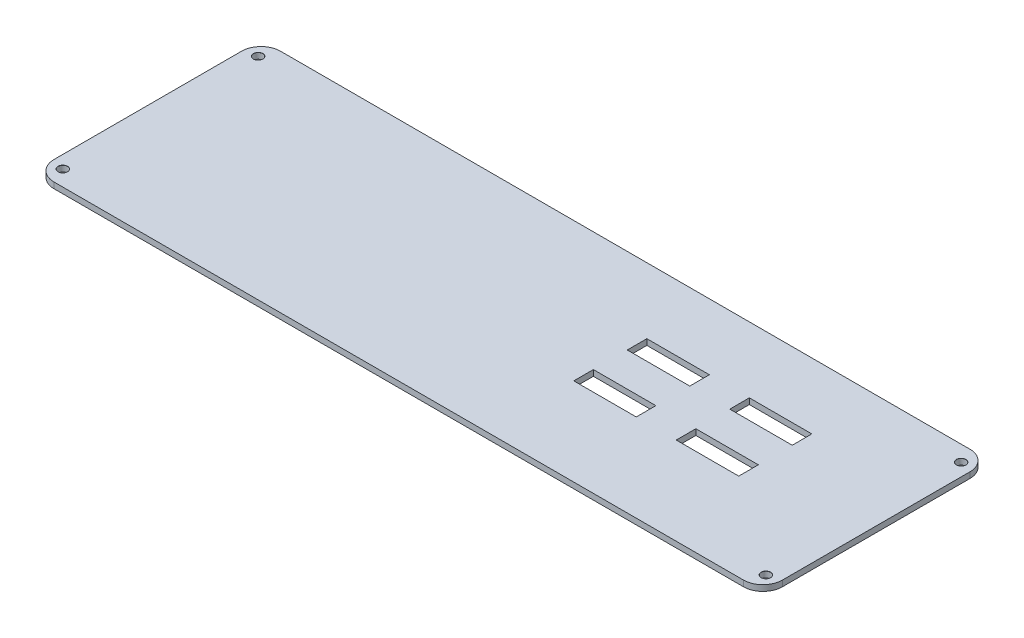
ISO-10303-21;
HEADER;
FILE_DESCRIPTION(('STEP AP214'),'2;1');
FILE_NAME('part.step','',(''),(''),'','','');
FILE_SCHEMA(('AUTOMOTIVE_DESIGN { 1 0 10303 214 1 1 1 1 }'));
ENDSEC;
DATA;
#1=APPLICATION_CONTEXT('core data for automotive mechanical design processes');
#2=APPLICATION_PROTOCOL_DEFINITION('international standard','automotive_design',2000,#1);
#3=PRODUCT_CONTEXT('',#1,'mechanical');
#4=PRODUCT('Part','Part','',(#3));
#5=PRODUCT_RELATED_PRODUCT_CATEGORY('part','',(#4));
#6=PRODUCT_DEFINITION_FORMATION('','',#4);
#7=PRODUCT_DEFINITION_CONTEXT('part definition',#1,'design');
#8=PRODUCT_DEFINITION('design','',#6,#7);
#9=PRODUCT_DEFINITION_SHAPE('','',#8);
#10=(LENGTH_UNIT() NAMED_UNIT(*) SI_UNIT(.MILLI.,.METRE.));
#11=(NAMED_UNIT(*) PLANE_ANGLE_UNIT() SI_UNIT($,.RADIAN.));
#12=(NAMED_UNIT(*) SI_UNIT($,.STERADIAN.) SOLID_ANGLE_UNIT());
#13=UNCERTAINTY_MEASURE_WITH_UNIT(LENGTH_MEASURE(1.E-05),#10,'distance_accuracy_value','');
#14=(GEOMETRIC_REPRESENTATION_CONTEXT(3) GLOBAL_UNCERTAINTY_ASSIGNED_CONTEXT((#13)) GLOBAL_UNIT_ASSIGNED_CONTEXT((#10,
#11,#12)) REPRESENTATION_CONTEXT('',''));
#15=CARTESIAN_POINT('',(0.,0.,0.));
#16=DIRECTION('',(0.,0.,1.));
#17=DIRECTION('',(1.,0.,0.));
#18=AXIS2_PLACEMENT_3D('',#15,#16,#17);
#19=CARTESIAN_POINT('',(-93.2500000000001,1.5,29.));
#20=DIRECTION('',(1.,0.,0.));
#21=DIRECTION('',(0.,0.,-1.));
#22=AXIS2_PLACEMENT_3D('',#19,#20,#21);
#23=PLANE('',#22);
#24=DIRECTION('',(0.,0.,1.));
#25=VECTOR('',#24,1.);
#26=CARTESIAN_POINT('',(-93.2500000000001,1.5,29.));
#27=LINE('',#26,#25);
#28=CARTESIAN_POINT('',(-93.2500000000001,1.5,-24.));
#29=VERTEX_POINT('',#28);
#30=CARTESIAN_POINT('',(-93.2500000000001,1.5,24.));
#31=VERTEX_POINT('',#30);
#32=EDGE_CURVE('E365',#29,#31,#27,.T.);
#33=ORIENTED_EDGE('',*,*,#32,.F.);
#34=DIRECTION('',(0.,-1.,0.));
#35=VECTOR('',#34,1.);
#36=CARTESIAN_POINT('',(-93.2500000000001,1.5,-24.));
#37=LINE('',#36,#35);
#38=CARTESIAN_POINT('',(-93.2500000000001,0.,-24.));
#39=VERTEX_POINT('',#38);
#40=EDGE_CURVE('E390',#29,#39,#37,.T.);
#41=ORIENTED_EDGE('',*,*,#40,.T.);
#42=DIRECTION('',(0.,0.,1.));
#43=VECTOR('',#42,1.);
#44=CARTESIAN_POINT('',(-93.2500000000001,0.,29.));
#45=LINE('',#44,#43);
#46=CARTESIAN_POINT('',(-93.2500000000001,0.,24.));
#47=VERTEX_POINT('',#46);
#48=EDGE_CURVE('E364',#39,#47,#45,.T.);
#49=ORIENTED_EDGE('',*,*,#48,.T.);
#50=DIRECTION('',(0.,-1.,0.));
#51=VECTOR('',#50,1.);
#52=CARTESIAN_POINT('',(-93.2500000000001,1.5,24.));
#53=LINE('',#52,#51);
#54=EDGE_CURVE('E378',#47,#31,#53,.F.);
#55=ORIENTED_EDGE('',*,*,#54,.T.);
#56=EDGE_LOOP('',(#33,#41,#49,#55));
#57=FACE_BOUND('',#56,.T.);
#58=ADVANCED_FACE('F37',(#57),#23,.F.);
#59=CARTESIAN_POINT('',(93.2499999999999,1.5,29.));
#60=DIRECTION('',(0.,0.,-1.));
#61=DIRECTION('',(-1.,0.,0.));
#62=AXIS2_PLACEMENT_3D('',#59,#60,#61);
#63=PLANE('',#62);
#64=DIRECTION('',(1.,0.,0.));
#65=VECTOR('',#64,1.);
#66=CARTESIAN_POINT('',(93.2499999999999,0.,29.));
#67=LINE('',#66,#65);
#68=CARTESIAN_POINT('',(-88.2500000000001,0.,29.));
#69=VERTEX_POINT('',#68);
#70=CARTESIAN_POINT('',(88.2499999999999,0.,29.));
#71=VERTEX_POINT('',#70);
#72=EDGE_CURVE('E381',#69,#71,#67,.T.);
#73=ORIENTED_EDGE('',*,*,#72,.T.);
#74=DIRECTION('',(0.,-1.,0.));
#75=VECTOR('',#74,1.);
#76=CARTESIAN_POINT('',(88.2499999999999,1.5,29.));
#77=LINE('',#76,#75);
#78=CARTESIAN_POINT('',(88.2499999999999,1.5,29.));
#79=VERTEX_POINT('',#78);
#80=EDGE_CURVE('E11',#71,#79,#77,.F.);
#81=ORIENTED_EDGE('',*,*,#80,.T.);
#82=DIRECTION('',(1.,0.,0.));
#83=VECTOR('',#82,1.);
#84=CARTESIAN_POINT('',(93.2499999999999,1.5,29.));
#85=LINE('',#84,#83);
#86=CARTESIAN_POINT('',(-88.2500000000001,1.5,29.));
#87=VERTEX_POINT('',#86);
#88=EDGE_CURVE('E368',#87,#79,#85,.T.);
#89=ORIENTED_EDGE('',*,*,#88,.F.);
#90=DIRECTION('',(0.,-1.,0.));
#91=VECTOR('',#90,1.);
#92=CARTESIAN_POINT('',(-88.2500000000001,1.5,29.));
#93=LINE('',#92,#91);
#94=EDGE_CURVE('E45',#87,#69,#93,.T.);
#95=ORIENTED_EDGE('',*,*,#94,.T.);
#96=EDGE_LOOP('',(#73,#81,#89,#95));
#97=FACE_BOUND('',#96,.T.);
#98=ADVANCED_FACE('F423',(#97),#63,.F.);
#99=CARTESIAN_POINT('',(93.2499999999999,1.5,29.));
#100=DIRECTION('',(-1.,0.,0.));
#101=DIRECTION('',(0.,0.,1.));
#102=AXIS2_PLACEMENT_3D('',#99,#100,#101);
#103=PLANE('',#102);
#104=DIRECTION('',(0.,0.,-1.));
#105=VECTOR('',#104,1.);
#106=CARTESIAN_POINT('',(93.2499999999999,0.,29.));
#107=LINE('',#106,#105);
#108=CARTESIAN_POINT('',(93.2499999999999,0.,24.));
#109=VERTEX_POINT('',#108);
#110=CARTESIAN_POINT('',(93.2499999999999,0.,-24.));
#111=VERTEX_POINT('',#110);
#112=EDGE_CURVE('E384',#109,#111,#107,.T.);
#113=ORIENTED_EDGE('',*,*,#112,.T.);
#114=DIRECTION('',(0.,-1.,0.));
#115=VECTOR('',#114,1.);
#116=CARTESIAN_POINT('',(93.2499999999999,1.5,-24.));
#117=LINE('',#116,#115);
#118=CARTESIAN_POINT('',(93.2499999999999,1.5,-24.));
#119=VERTEX_POINT('',#118);
#120=EDGE_CURVE('E417',#111,#119,#117,.F.);
#121=ORIENTED_EDGE('',*,*,#120,.T.);
#122=DIRECTION('',(0.,0.,-1.));
#123=VECTOR('',#122,1.);
#124=CARTESIAN_POINT('',(93.2499999999999,1.5,29.));
#125=LINE('',#124,#123);
#126=CARTESIAN_POINT('',(93.2499999999999,1.5,24.));
#127=VERTEX_POINT('',#126);
#128=EDGE_CURVE('E372',#127,#119,#125,.T.);
#129=ORIENTED_EDGE('',*,*,#128,.F.);
#130=DIRECTION('',(0.,-1.,0.));
#131=VECTOR('',#130,1.);
#132=CARTESIAN_POINT('',(93.2499999999999,1.5,24.));
#133=LINE('',#132,#131);
#134=EDGE_CURVE('E414',#127,#109,#133,.T.);
#135=ORIENTED_EDGE('',*,*,#134,.T.);
#136=EDGE_LOOP('',(#113,#121,#129,#135));
#137=FACE_BOUND('',#136,.T.);
#138=ADVANCED_FACE('F437',(#137),#103,.F.);
#139=CARTESIAN_POINT('',(93.2499999999999,1.5,-29.));
#140=DIRECTION('',(0.,0.,1.));
#141=DIRECTION('',(1.,0.,0.));
#142=AXIS2_PLACEMENT_3D('',#139,#140,#141);
#143=PLANE('',#142);
#144=DIRECTION('',(-1.,0.,0.));
#145=VECTOR('',#144,1.);
#146=CARTESIAN_POINT('',(93.2499999999999,0.,-29.));
#147=LINE('',#146,#145);
#148=CARTESIAN_POINT('',(88.2499999999999,0.,-29.));
#149=VERTEX_POINT('',#148);
#150=CARTESIAN_POINT('',(-88.2500000000001,0.,-29.));
#151=VERTEX_POINT('',#150);
#152=EDGE_CURVE('E369',#149,#151,#147,.T.);
#153=ORIENTED_EDGE('',*,*,#152,.T.);
#154=DIRECTION('',(0.,-1.,0.));
#155=VECTOR('',#154,1.);
#156=CARTESIAN_POINT('',(-88.2500000000001,1.5,-29.));
#157=LINE('',#156,#155);
#158=CARTESIAN_POINT('',(-88.2500000000001,1.5,-29.));
#159=VERTEX_POINT('',#158);
#160=EDGE_CURVE('E404',#151,#159,#157,.F.);
#161=ORIENTED_EDGE('',*,*,#160,.T.);
#162=DIRECTION('',(-1.,0.,0.));
#163=VECTOR('',#162,1.);
#164=CARTESIAN_POINT('',(93.2499999999999,1.5,-29.));
#165=LINE('',#164,#163);
#166=CARTESIAN_POINT('',(88.2499999999999,1.5,-29.));
#167=VERTEX_POINT('',#166);
#168=EDGE_CURVE('E375',#167,#159,#165,.T.);
#169=ORIENTED_EDGE('',*,*,#168,.F.);
#170=DIRECTION('',(0.,-1.,0.));
#171=VECTOR('',#170,1.);
#172=CARTESIAN_POINT('',(88.2499999999999,1.5,-29.));
#173=LINE('',#172,#171);
#174=EDGE_CURVE('E401',#167,#149,#173,.T.);
#175=ORIENTED_EDGE('',*,*,#174,.T.);
#176=EDGE_LOOP('',(#153,#161,#169,#175));
#177=FACE_BOUND('',#176,.T.);
#178=ADVANCED_FACE('F447',(#177),#143,.F.);
#179=CARTESIAN_POINT('',(0.,1.5,0.));
#180=DIRECTION('',(0.,1.,0.));
#181=DIRECTION('',(0.,0.,1.));
#182=AXIS2_PLACEMENT_3D('',#179,#180,#181);
#183=PLANE('',#182);
#184=DIRECTION('',(0.,0.,1.));
#185=VECTOR('',#184,1.);
#186=CARTESIAN_POINT('',(48.6113406976716,1.5,-12.1528351744179));
#187=LINE('',#186,#185);
#188=CARTESIAN_POINT('',(48.6113406976716,1.5,-12.1528351744179));
#189=VERTEX_POINT('',#188);
#190=CARTESIAN_POINT('',(48.6113406976716,1.5,-7.1373793881502));
#191=VERTEX_POINT('',#190);
#192=EDGE_CURVE('E52',#189,#191,#187,.T.);
#193=ORIENTED_EDGE('',*,*,#192,.F.);
#194=DIRECTION('',(-1.,0.,0.));
#195=VECTOR('',#194,1.);
#196=CARTESIAN_POINT('',(48.6113406976716,1.5,-12.1528351744179));
#197=LINE('',#196,#195);
#198=CARTESIAN_POINT('',(64.6113406976716,1.5,-12.1528351744179));
#199=VERTEX_POINT('',#198);
#200=EDGE_CURVE('E248',#199,#189,#197,.T.);
#201=ORIENTED_EDGE('',*,*,#200,.F.);
#202=DIRECTION('',(0.,0.,-1.));
#203=VECTOR('',#202,1.);
#204=CARTESIAN_POINT('',(64.6113406976716,1.5,-12.1528351744179));
#205=LINE('',#204,#203);
#206=CARTESIAN_POINT('',(64.6113406976716,1.5,-7.1373793881502));
#207=VERTEX_POINT('',#206);
#208=EDGE_CURVE('E251',#207,#199,#205,.T.);
#209=ORIENTED_EDGE('',*,*,#208,.F.);
#210=DIRECTION('',(1.,0.,0.));
#211=VECTOR('',#210,1.);
#212=CARTESIAN_POINT('',(48.6113406976716,1.5,-7.1373793881502));
#213=LINE('',#212,#211);
#214=EDGE_CURVE('E255',#191,#207,#213,.T.);
#215=ORIENTED_EDGE('',*,*,#214,.F.);
#216=EDGE_LOOP('',(#193,#201,#209,#215));
#217=FACE_BOUND('',#216,.T.);
#218=DIRECTION('',(0.,0.,1.));
#219=VECTOR('',#218,1.);
#220=CARTESIAN_POINT('',(22.3766488925789,1.5,1.54321716500545));
#221=LINE('',#220,#219);
#222=CARTESIAN_POINT('',(22.3766488925789,1.5,1.54321716500545));
#223=VERTEX_POINT('',#222);
#224=CARTESIAN_POINT('',(22.3766488925789,1.5,6.55867295127315));
#225=VERTEX_POINT('',#224);
#226=EDGE_CURVE('E60',#223,#225,#221,.T.);
#227=ORIENTED_EDGE('',*,*,#226,.F.);
#228=DIRECTION('',(-1.,0.,0.));
#229=VECTOR('',#228,1.);
#230=CARTESIAN_POINT('',(22.3766488925789,1.5,1.54321716500545));
#231=LINE('',#230,#229);
#232=CARTESIAN_POINT('',(38.3766488925789,1.5,1.54321716500545));
#233=VERTEX_POINT('',#232);
#234=EDGE_CURVE('E276',#233,#223,#231,.T.);
#235=ORIENTED_EDGE('',*,*,#234,.F.);
#236=DIRECTION('',(0.,0.,-1.));
#237=VECTOR('',#236,1.);
#238=CARTESIAN_POINT('',(38.3766488925789,1.5,1.54321716500545));
#239=LINE('',#238,#237);
#240=CARTESIAN_POINT('',(38.3766488925789,1.5,6.55867295127315));
#241=VERTEX_POINT('',#240);
#242=EDGE_CURVE('E279',#241,#233,#239,.T.);
#243=ORIENTED_EDGE('',*,*,#242,.F.);
#244=DIRECTION('',(1.,0.,0.));
#245=VECTOR('',#244,1.);
#246=CARTESIAN_POINT('',(22.3766488925789,1.5,6.55867295127315));
#247=LINE('',#246,#245);
#248=EDGE_CURVE('E283',#225,#241,#247,.T.);
#249=ORIENTED_EDGE('',*,*,#248,.F.);
#250=EDGE_LOOP('',(#227,#235,#243,#249));
#251=FACE_BOUND('',#250,.T.);
#252=DIRECTION('',(0.,0.,1.));
#253=VECTOR('',#252,1.);
#254=CARTESIAN_POINT('',(48.6113406976716,1.5,1.54321716500545));
#255=LINE('',#254,#253);
#256=CARTESIAN_POINT('',(48.6113406976716,1.5,1.54321716500545));
#257=VERTEX_POINT('',#256);
#258=CARTESIAN_POINT('',(48.6113406976716,1.5,6.55867295127315));
#259=VERTEX_POINT('',#258);
#260=EDGE_CURVE('E200',#257,#259,#255,.T.);
#261=ORIENTED_EDGE('',*,*,#260,.F.);
#262=DIRECTION('',(-1.,0.,0.));
#263=VECTOR('',#262,1.);
#264=CARTESIAN_POINT('',(48.6113406976716,1.5,1.54321716500545));
#265=LINE('',#264,#263);
#266=CARTESIAN_POINT('',(64.6113406976716,1.5,1.54321716500545));
#267=VERTEX_POINT('',#266);
#268=EDGE_CURVE('E210',#267,#257,#265,.T.);
#269=ORIENTED_EDGE('',*,*,#268,.F.);
#270=DIRECTION('',(0.,0.,-1.));
#271=VECTOR('',#270,1.);
#272=CARTESIAN_POINT('',(64.6113406976716,1.5,1.54321716500545));
#273=LINE('',#272,#271);
#274=CARTESIAN_POINT('',(64.6113406976716,1.5,6.55867295127315));
#275=VERTEX_POINT('',#274);
#276=EDGE_CURVE('E215',#275,#267,#273,.T.);
#277=ORIENTED_EDGE('',*,*,#276,.F.);
#278=DIRECTION('',(1.,0.,0.));
#279=VECTOR('',#278,1.);
#280=CARTESIAN_POINT('',(48.6113406976716,1.5,6.55867295127315));
#281=LINE('',#280,#279);
#282=EDGE_CURVE('E221',#259,#275,#281,.T.);
#283=ORIENTED_EDGE('',*,*,#282,.F.);
#284=EDGE_LOOP('',(#261,#269,#277,#283));
#285=FACE_BOUND('',#284,.T.);
#286=DIRECTION('',(0.,0.,1.));
#287=VECTOR('',#286,1.);
#288=CARTESIAN_POINT('',(22.3766488925789,1.5,-12.1528351744179));
#289=LINE('',#288,#287);
#290=CARTESIAN_POINT('',(22.3766488925789,1.5,-12.1528351744179));
#291=VERTEX_POINT('',#290);
#292=CARTESIAN_POINT('',(22.3766488925789,1.5,-7.1373793881502));
#293=VERTEX_POINT('',#292);
#294=EDGE_CURVE('E259',#291,#293,#289,.T.);
#295=ORIENTED_EDGE('',*,*,#294,.F.);
#296=DIRECTION('',(-1.,0.,0.));
#297=VECTOR('',#296,1.);
#298=CARTESIAN_POINT('',(22.3766488925789,1.5,-12.1528351744179));
#299=LINE('',#298,#297);
#300=CARTESIAN_POINT('',(38.3766488925789,1.5,-12.1528351744179));
#301=VERTEX_POINT('',#300);
#302=EDGE_CURVE('E301',#301,#291,#299,.T.);
#303=ORIENTED_EDGE('',*,*,#302,.F.);
#304=DIRECTION('',(0.,0.,-1.));
#305=VECTOR('',#304,1.);
#306=CARTESIAN_POINT('',(38.3766488925789,1.5,-12.1528351744179));
#307=LINE('',#306,#305);
#308=CARTESIAN_POINT('',(38.3766488925789,1.5,-7.1373793881502));
#309=VERTEX_POINT('',#308);
#310=EDGE_CURVE('E315',#309,#301,#307,.T.);
#311=ORIENTED_EDGE('',*,*,#310,.F.);
#312=DIRECTION('',(1.,0.,0.));
#313=VECTOR('',#312,1.);
#314=CARTESIAN_POINT('',(22.3766488925789,1.5,-7.1373793881502));
#315=LINE('',#314,#313);
#316=EDGE_CURVE('E312',#293,#309,#315,.T.);
#317=ORIENTED_EDGE('',*,*,#316,.F.);
#318=EDGE_LOOP('',(#295,#303,#311,#317));
#319=FACE_BOUND('',#318,.T.);
#320=CARTESIAN_POINT('',(-90.,1.5,-25.));
#321=DIRECTION('',(0.,1.,0.));
#322=DIRECTION('',(0.,0.,1.));
#323=AXIS2_PLACEMENT_3D('',#320,#321,#322);
#324=CIRCLE('',#323,1.225);
#325=CARTESIAN_POINT('',(-90.,1.5,-23.775));
#326=VERTEX_POINT('',#325);
#327=EDGE_CURVE('E322',#326,#326,#324,.T.);
#328=ORIENTED_EDGE('',*,*,#327,.F.);
#329=EDGE_LOOP('',(#328));
#330=FACE_BOUND('',#329,.T.);
#331=CARTESIAN_POINT('',(90.,1.5,-25.));
#332=DIRECTION('',(0.,1.,0.));
#333=DIRECTION('',(0.,0.,1.));
#334=AXIS2_PLACEMENT_3D('',#331,#332,#333);
#335=CIRCLE('',#334,1.225);
#336=CARTESIAN_POINT('',(90.,1.5,-23.775));
#337=VERTEX_POINT('',#336);
#338=EDGE_CURVE('E337',#337,#337,#335,.T.);
#339=ORIENTED_EDGE('',*,*,#338,.F.);
#340=EDGE_LOOP('',(#339));
#341=FACE_BOUND('',#340,.T.);
#342=CARTESIAN_POINT('',(90.,1.5,25.));
#343=DIRECTION('',(0.,1.,0.));
#344=DIRECTION('',(0.,0.,1.));
#345=AXIS2_PLACEMENT_3D('',#342,#343,#344);
#346=CIRCLE('',#345,1.225);
#347=CARTESIAN_POINT('',(90.,1.5,26.225));
#348=VERTEX_POINT('',#347);
#349=EDGE_CURVE('E346',#348,#348,#346,.T.);
#350=ORIENTED_EDGE('',*,*,#349,.F.);
#351=EDGE_LOOP('',(#350));
#352=FACE_BOUND('',#351,.T.);
#353=CARTESIAN_POINT('',(-90.,1.5,25.));
#354=DIRECTION('',(0.,1.,0.));
#355=DIRECTION('',(0.,0.,1.));
#356=AXIS2_PLACEMENT_3D('',#353,#354,#355);
#357=CIRCLE('',#356,1.225);
#358=CARTESIAN_POINT('',(-90.,1.5,26.225));
#359=VERTEX_POINT('',#358);
#360=EDGE_CURVE('E355',#359,#359,#357,.T.);
#361=ORIENTED_EDGE('',*,*,#360,.F.);
#362=EDGE_LOOP('',(#361));
#363=FACE_BOUND('',#362,.T.);
#364=ORIENTED_EDGE('',*,*,#168,.T.);
#365=CARTESIAN_POINT('',(-88.2500000000001,1.5,-24.));
#366=DIRECTION('',(0.,1.,0.));
#367=DIRECTION('',(0.,0.,1.));
#368=AXIS2_PLACEMENT_3D('',#365,#366,#367);
#369=CIRCLE('',#368,5.);
#370=EDGE_CURVE('E412',#159,#29,#369,.T.);
#371=ORIENTED_EDGE('',*,*,#370,.T.);
#372=ORIENTED_EDGE('',*,*,#32,.T.);
#373=CARTESIAN_POINT('',(-88.2500000000001,1.5,24.));
#374=DIRECTION('',(0.,1.,0.));
#375=DIRECTION('',(0.,0.,1.));
#376=AXIS2_PLACEMENT_3D('',#373,#374,#375);
#377=CIRCLE('',#376,5.);
#378=EDGE_CURVE('E406',#31,#87,#377,.T.);
#379=ORIENTED_EDGE('',*,*,#378,.T.);
#380=ORIENTED_EDGE('',*,*,#88,.T.);
#381=CARTESIAN_POINT('',(88.2499999999999,1.5,24.));
#382=DIRECTION('',(0.,1.,0.));
#383=DIRECTION('',(0.,0.,1.));
#384=AXIS2_PLACEMENT_3D('',#381,#382,#383);
#385=CIRCLE('',#384,5.);
#386=EDGE_CURVE('E408',#79,#127,#385,.T.);
#387=ORIENTED_EDGE('',*,*,#386,.T.);
#388=ORIENTED_EDGE('',*,*,#128,.T.);
#389=CARTESIAN_POINT('',(88.2499999999999,1.5,-24.));
#390=DIRECTION('',(0.,1.,0.));
#391=DIRECTION('',(0.,0.,1.));
#392=AXIS2_PLACEMENT_3D('',#389,#390,#391);
#393=CIRCLE('',#392,5.);
#394=EDGE_CURVE('E410',#119,#167,#393,.T.);
#395=ORIENTED_EDGE('',*,*,#394,.T.);
#396=EDGE_LOOP('',(#364,#371,#372,#379,#380,#387,#388,#395));
#397=FACE_BOUND('',#396,.T.);
#398=ADVANCED_FACE('F218',(#217,#251,#285,#319,#330,#341,#352,#363,#397),#183,.T.);
#399=CARTESIAN_POINT('',(0.,0.,0.));
#400=DIRECTION('',(0.,1.,0.));
#401=DIRECTION('',(0.,0.,1.));
#402=AXIS2_PLACEMENT_3D('',#399,#400,#401);
#403=PLANE('',#402);
#404=DIRECTION('',(-1.,0.,0.));
#405=VECTOR('',#404,1.);
#406=CARTESIAN_POINT('',(48.6113406976716,0.,-12.1528351744179));
#407=LINE('',#406,#405);
#408=CARTESIAN_POINT('',(64.6113406976716,0.,-12.1528351744179));
#409=VERTEX_POINT('',#408);
#410=CARTESIAN_POINT('',(48.6113406976716,0.,-12.1528351744179));
#411=VERTEX_POINT('',#410);
#412=EDGE_CURVE('E241',#409,#411,#407,.T.);
#413=ORIENTED_EDGE('',*,*,#412,.T.);
#414=DIRECTION('',(0.,0.,1.));
#415=VECTOR('',#414,1.);
#416=CARTESIAN_POINT('',(48.6113406976716,0.,-12.1528351744179));
#417=LINE('',#416,#415);
#418=CARTESIAN_POINT('',(48.6113406976716,0.,-7.1373793881502));
#419=VERTEX_POINT('',#418);
#420=EDGE_CURVE('E252',#411,#419,#417,.T.);
#421=ORIENTED_EDGE('',*,*,#420,.T.);
#422=DIRECTION('',(1.,0.,0.));
#423=VECTOR('',#422,1.);
#424=CARTESIAN_POINT('',(48.6113406976716,0.,-7.1373793881502));
#425=LINE('',#424,#423);
#426=CARTESIAN_POINT('',(64.6113406976716,0.,-7.1373793881502));
#427=VERTEX_POINT('',#426);
#428=EDGE_CURVE('E265',#419,#427,#425,.T.);
#429=ORIENTED_EDGE('',*,*,#428,.T.);
#430=DIRECTION('',(0.,0.,-1.));
#431=VECTOR('',#430,1.);
#432=CARTESIAN_POINT('',(64.6113406976716,0.,-12.1528351744179));
#433=LINE('',#432,#431);
#434=EDGE_CURVE('E262',#427,#409,#433,.T.);
#435=ORIENTED_EDGE('',*,*,#434,.T.);
#436=EDGE_LOOP('',(#413,#421,#429,#435));
#437=FACE_BOUND('',#436,.T.);
#438=DIRECTION('',(-1.,0.,0.));
#439=VECTOR('',#438,1.);
#440=CARTESIAN_POINT('',(22.3766488925789,0.,1.54321716500545));
#441=LINE('',#440,#439);
#442=CARTESIAN_POINT('',(38.3766488925789,0.,1.54321716500545));
#443=VERTEX_POINT('',#442);
#444=CARTESIAN_POINT('',(22.3766488925789,0.,1.54321716500545));
#445=VERTEX_POINT('',#444);
#446=EDGE_CURVE('E272',#443,#445,#441,.T.);
#447=ORIENTED_EDGE('',*,*,#446,.T.);
#448=DIRECTION('',(0.,0.,1.));
#449=VECTOR('',#448,1.);
#450=CARTESIAN_POINT('',(22.3766488925789,0.,1.54321716500545));
#451=LINE('',#450,#449);
#452=CARTESIAN_POINT('',(22.3766488925789,0.,6.55867295127315));
#453=VERTEX_POINT('',#452);
#454=EDGE_CURVE('E280',#445,#453,#451,.T.);
#455=ORIENTED_EDGE('',*,*,#454,.T.);
#456=DIRECTION('',(1.,0.,0.));
#457=VECTOR('',#456,1.);
#458=CARTESIAN_POINT('',(22.3766488925789,0.,6.55867295127315));
#459=LINE('',#458,#457);
#460=CARTESIAN_POINT('',(38.3766488925789,0.,6.55867295127315));
#461=VERTEX_POINT('',#460);
#462=EDGE_CURVE('E292',#453,#461,#459,.T.);
#463=ORIENTED_EDGE('',*,*,#462,.T.);
#464=DIRECTION('',(0.,0.,-1.));
#465=VECTOR('',#464,1.);
#466=CARTESIAN_POINT('',(38.3766488925789,0.,1.54321716500545));
#467=LINE('',#466,#465);
#468=EDGE_CURVE('E289',#461,#443,#467,.T.);
#469=ORIENTED_EDGE('',*,*,#468,.T.);
#470=EDGE_LOOP('',(#447,#455,#463,#469));
#471=FACE_BOUND('',#470,.T.);
#472=DIRECTION('',(-1.,0.,0.));
#473=VECTOR('',#472,1.);
#474=CARTESIAN_POINT('',(48.6113406976716,0.,1.54321716500545));
#475=LINE('',#474,#473);
#476=CARTESIAN_POINT('',(64.6113406976716,0.,1.54321716500545));
#477=VERTEX_POINT('',#476);
#478=CARTESIAN_POINT('',(48.6113406976716,0.,1.54321716500545));
#479=VERTEX_POINT('',#478);
#480=EDGE_CURVE('E229',#477,#479,#475,.T.);
#481=ORIENTED_EDGE('',*,*,#480,.T.);
#482=DIRECTION('',(0.,0.,1.));
#483=VECTOR('',#482,1.);
#484=CARTESIAN_POINT('',(48.6113406976716,0.,1.54321716500545));
#485=LINE('',#484,#483);
#486=CARTESIAN_POINT('',(48.6113406976716,0.,6.55867295127315));
#487=VERTEX_POINT('',#486);
#488=EDGE_CURVE('E203',#479,#487,#485,.T.);
#489=ORIENTED_EDGE('',*,*,#488,.T.);
#490=DIRECTION('',(1.,0.,0.));
#491=VECTOR('',#490,1.);
#492=CARTESIAN_POINT('',(48.6113406976716,0.,6.55867295127315));
#493=LINE('',#492,#491);
#494=CARTESIAN_POINT('',(64.6113406976716,0.,6.55867295127315));
#495=VERTEX_POINT('',#494);
#496=EDGE_CURVE('E235',#487,#495,#493,.T.);
#497=ORIENTED_EDGE('',*,*,#496,.T.);
#498=DIRECTION('',(0.,0.,-1.));
#499=VECTOR('',#498,1.);
#500=CARTESIAN_POINT('',(64.6113406976716,0.,1.54321716500545));
#501=LINE('',#500,#499);
#502=EDGE_CURVE('E231',#495,#477,#501,.T.);
#503=ORIENTED_EDGE('',*,*,#502,.T.);
#504=EDGE_LOOP('',(#481,#489,#497,#503));
#505=FACE_BOUND('',#504,.T.);
#506=DIRECTION('',(-1.,0.,0.));
#507=VECTOR('',#506,1.);
#508=CARTESIAN_POINT('',(22.3766488925789,0.,-12.1528351744179));
#509=LINE('',#508,#507);
#510=CARTESIAN_POINT('',(38.3766488925789,0.,-12.1528351744179));
#511=VERTEX_POINT('',#510);
#512=CARTESIAN_POINT('',(22.3766488925789,0.,-12.1528351744179));
#513=VERTEX_POINT('',#512);
#514=EDGE_CURVE('E307',#511,#513,#509,.T.);
#515=ORIENTED_EDGE('',*,*,#514,.T.);
#516=DIRECTION('',(0.,0.,1.));
#517=VECTOR('',#516,1.);
#518=CARTESIAN_POINT('',(22.3766488925789,0.,-12.1528351744179));
#519=LINE('',#518,#517);
#520=CARTESIAN_POINT('',(22.3766488925789,0.,-7.1373793881502));
#521=VERTEX_POINT('',#520);
#522=EDGE_CURVE('E297',#513,#521,#519,.T.);
#523=ORIENTED_EDGE('',*,*,#522,.T.);
#524=DIRECTION('',(1.,0.,0.));
#525=VECTOR('',#524,1.);
#526=CARTESIAN_POINT('',(22.3766488925789,0.,-7.1373793881502));
#527=LINE('',#526,#525);
#528=CARTESIAN_POINT('',(38.3766488925789,0.,-7.1373793881502));
#529=VERTEX_POINT('',#528);
#530=EDGE_CURVE('E300',#521,#529,#527,.T.);
#531=ORIENTED_EDGE('',*,*,#530,.T.);
#532=DIRECTION('',(0.,0.,-1.));
#533=VECTOR('',#532,1.);
#534=CARTESIAN_POINT('',(38.3766488925789,0.,-12.1528351744179));
#535=LINE('',#534,#533);
#536=EDGE_CURVE('E304',#529,#511,#535,.T.);
#537=ORIENTED_EDGE('',*,*,#536,.T.);
#538=EDGE_LOOP('',(#515,#523,#531,#537));
#539=FACE_BOUND('',#538,.T.);
#540=CARTESIAN_POINT('',(-90.,0.,-25.));
#541=DIRECTION('',(0.,1.,0.));
#542=DIRECTION('',(0.,0.,1.));
#543=AXIS2_PLACEMENT_3D('',#540,#541,#542);
#544=CIRCLE('',#543,1.19999999999999);
#545=CARTESIAN_POINT('',(-90.,0.,-23.8));
#546=VERTEX_POINT('',#545);
#547=EDGE_CURVE('E334',#546,#546,#544,.T.);
#548=ORIENTED_EDGE('',*,*,#547,.T.);
#549=EDGE_LOOP('',(#548));
#550=FACE_BOUND('',#549,.T.);
#551=CARTESIAN_POINT('',(90.,0.,-25.));
#552=DIRECTION('',(0.,1.,0.));
#553=DIRECTION('',(0.,0.,1.));
#554=AXIS2_PLACEMENT_3D('',#551,#552,#553);
#555=CIRCLE('',#554,1.19999999999999);
#556=CARTESIAN_POINT('',(90.,0.,-23.8));
#557=VERTEX_POINT('',#556);
#558=EDGE_CURVE('E343',#557,#557,#555,.T.);
#559=ORIENTED_EDGE('',*,*,#558,.T.);
#560=EDGE_LOOP('',(#559));
#561=FACE_BOUND('',#560,.T.);
#562=CARTESIAN_POINT('',(90.,0.,25.));
#563=DIRECTION('',(0.,1.,0.));
#564=DIRECTION('',(0.,0.,1.));
#565=AXIS2_PLACEMENT_3D('',#562,#563,#564);
#566=CIRCLE('',#565,1.19999999999999);
#567=CARTESIAN_POINT('',(90.,0.,26.2));
#568=VERTEX_POINT('',#567);
#569=EDGE_CURVE('E352',#568,#568,#566,.T.);
#570=ORIENTED_EDGE('',*,*,#569,.T.);
#571=EDGE_LOOP('',(#570));
#572=FACE_BOUND('',#571,.T.);
#573=CARTESIAN_POINT('',(-90.,0.,25.));
#574=DIRECTION('',(0.,1.,0.));
#575=DIRECTION('',(0.,0.,1.));
#576=AXIS2_PLACEMENT_3D('',#573,#574,#575);
#577=CIRCLE('',#576,1.19999999999999);
#578=CARTESIAN_POINT('',(-90.,0.,26.2));
#579=VERTEX_POINT('',#578);
#580=EDGE_CURVE('E361',#579,#579,#577,.T.);
#581=ORIENTED_EDGE('',*,*,#580,.T.);
#582=EDGE_LOOP('',(#581));
#583=FACE_BOUND('',#582,.T.);
#584=ORIENTED_EDGE('',*,*,#48,.F.);
#585=CARTESIAN_POINT('',(-88.2500000000001,0.,-24.));
#586=DIRECTION('',(0.,1.,0.));
#587=DIRECTION('',(0.,0.,1.));
#588=AXIS2_PLACEMENT_3D('',#585,#586,#587);
#589=CIRCLE('',#588,5.);
#590=EDGE_CURVE('E399',#39,#151,#589,.F.);
#591=ORIENTED_EDGE('',*,*,#590,.T.);
#592=ORIENTED_EDGE('',*,*,#152,.F.);
#593=CARTESIAN_POINT('',(88.2499999999999,0.,-24.));
#594=DIRECTION('',(0.,1.,0.));
#595=DIRECTION('',(0.,0.,1.));
#596=AXIS2_PLACEMENT_3D('',#593,#594,#595);
#597=CIRCLE('',#596,5.);
#598=EDGE_CURVE('E397',#149,#111,#597,.F.);
#599=ORIENTED_EDGE('',*,*,#598,.T.);
#600=ORIENTED_EDGE('',*,*,#112,.F.);
#601=CARTESIAN_POINT('',(88.2499999999999,0.,24.));
#602=DIRECTION('',(0.,1.,0.));
#603=DIRECTION('',(0.,0.,1.));
#604=AXIS2_PLACEMENT_3D('',#601,#602,#603);
#605=CIRCLE('',#604,5.);
#606=EDGE_CURVE('E395',#109,#71,#605,.F.);
#607=ORIENTED_EDGE('',*,*,#606,.T.);
#608=ORIENTED_EDGE('',*,*,#72,.F.);
#609=CARTESIAN_POINT('',(-88.2500000000001,0.,24.));
#610=DIRECTION('',(0.,1.,0.));
#611=DIRECTION('',(0.,0.,1.));
#612=AXIS2_PLACEMENT_3D('',#609,#610,#611);
#613=CIRCLE('',#612,5.);
#614=EDGE_CURVE('E393',#69,#47,#613,.F.);
#615=ORIENTED_EDGE('',*,*,#614,.T.);
#616=EDGE_LOOP('',(#584,#591,#592,#599,#600,#607,#608,#615));
#617=FACE_BOUND('',#616,.T.);
#618=ADVANCED_FACE('F429',(#437,#471,#505,#539,#550,#561,#572,#583,#617),#403,.F.);
#619=CARTESIAN_POINT('',(-88.2500000000001,1.5,-24.));
#620=DIRECTION('',(0.,-1.,0.));
#621=DIRECTION('',(0.,0.,-1.));
#622=AXIS2_PLACEMENT_3D('',#619,#620,#621);
#623=CYLINDRICAL_SURFACE('',#622,5.);
#624=ORIENTED_EDGE('',*,*,#370,.F.);
#625=ORIENTED_EDGE('',*,*,#160,.F.);
#626=ORIENTED_EDGE('',*,*,#590,.F.);
#627=ORIENTED_EDGE('',*,*,#40,.F.);
#628=EDGE_LOOP('',(#624,#625,#626,#627));
#629=FACE_BOUND('',#628,.T.);
#630=ADVANCED_FACE('F452',(#629),#623,.T.);
#631=CARTESIAN_POINT('',(88.2499999999999,1.5,-24.));
#632=DIRECTION('',(0.,-1.,0.));
#633=DIRECTION('',(0.,0.,-1.));
#634=AXIS2_PLACEMENT_3D('',#631,#632,#633);
#635=CYLINDRICAL_SURFACE('',#634,5.);
#636=ORIENTED_EDGE('',*,*,#394,.F.);
#637=ORIENTED_EDGE('',*,*,#120,.F.);
#638=ORIENTED_EDGE('',*,*,#598,.F.);
#639=ORIENTED_EDGE('',*,*,#174,.F.);
#640=EDGE_LOOP('',(#636,#637,#638,#639));
#641=FACE_BOUND('',#640,.T.);
#642=ADVANCED_FACE('F444',(#641),#635,.T.);
#643=CARTESIAN_POINT('',(88.2499999999999,1.5,24.));
#644=DIRECTION('',(0.,-1.,0.));
#645=DIRECTION('',(0.,0.,-1.));
#646=AXIS2_PLACEMENT_3D('',#643,#644,#645);
#647=CYLINDRICAL_SURFACE('',#646,5.);
#648=ORIENTED_EDGE('',*,*,#386,.F.);
#649=ORIENTED_EDGE('',*,*,#80,.F.);
#650=ORIENTED_EDGE('',*,*,#606,.F.);
#651=ORIENTED_EDGE('',*,*,#134,.F.);
#652=EDGE_LOOP('',(#648,#649,#650,#651));
#653=FACE_BOUND('',#652,.T.);
#654=ADVANCED_FACE('F434',(#653),#647,.T.);
#655=CARTESIAN_POINT('',(-88.2500000000001,1.5,24.));
#656=DIRECTION('',(0.,-1.,0.));
#657=DIRECTION('',(0.,0.,-1.));
#658=AXIS2_PLACEMENT_3D('',#655,#656,#657);
#659=CYLINDRICAL_SURFACE('',#658,5.);
#660=ORIENTED_EDGE('',*,*,#378,.F.);
#661=ORIENTED_EDGE('',*,*,#54,.F.);
#662=ORIENTED_EDGE('',*,*,#614,.F.);
#663=ORIENTED_EDGE('',*,*,#94,.F.);
#664=EDGE_LOOP('',(#660,#661,#662,#663));
#665=FACE_BOUND('',#664,.T.);
#666=ADVANCED_FACE('F39',(#665),#659,.T.);
#667=CARTESIAN_POINT('',(-90.,1.5,25.));
#668=DIRECTION('',(0.,1.,0.));
#669=DIRECTION('',(0.,0.,1.));
#670=AXIS2_PLACEMENT_3D('',#667,#668,#669);
#671=CYLINDRICAL_SURFACE('',#670,1.19999999999999);
#672=ORIENTED_EDGE('',*,*,#580,.F.);
#673=EDGE_LOOP('',(#672));
#674=FACE_BOUND('',#673,.T.);
#675=CARTESIAN_POINT('',(-90.,1.475,25.));
#676=DIRECTION('',(0.,1.,0.));
#677=DIRECTION('',(0.,0.,1.));
#678=AXIS2_PLACEMENT_3D('',#675,#676,#677);
#679=CIRCLE('',#678,1.19999999999999);
#680=CARTESIAN_POINT('',(-90.,1.475,26.2));
#681=VERTEX_POINT('',#680);
#682=EDGE_CURVE('E358',#681,#681,#679,.T.);
#683=ORIENTED_EDGE('',*,*,#682,.T.);
#684=EDGE_LOOP('',(#683));
#685=FACE_BOUND('',#684,.T.);
#686=ADVANCED_FACE('F457',(#674,#685),#671,.F.);
#687=CARTESIAN_POINT('',(-90.,1.5,25.));
#688=DIRECTION('',(0.,1.,0.));
#689=DIRECTION('',(0.,0.,1.));
#690=AXIS2_PLACEMENT_3D('',#687,#688,#689);
#691=CONICAL_SURFACE('',#690,1.225,0.785398163397726);
#692=ORIENTED_EDGE('',*,*,#682,.F.);
#693=EDGE_LOOP('',(#692));
#694=FACE_BOUND('',#693,.T.);
#695=ORIENTED_EDGE('',*,*,#360,.T.);
#696=EDGE_LOOP('',(#695));
#697=FACE_BOUND('',#696,.T.);
#698=ADVANCED_FACE('F462',(#694,#697),#691,.F.);
#699=CARTESIAN_POINT('',(90.,1.5,25.));
#700=DIRECTION('',(0.,1.,0.));
#701=DIRECTION('',(0.,0.,1.));
#702=AXIS2_PLACEMENT_3D('',#699,#700,#701);
#703=CYLINDRICAL_SURFACE('',#702,1.19999999999999);
#704=ORIENTED_EDGE('',*,*,#569,.F.);
#705=EDGE_LOOP('',(#704));
#706=FACE_BOUND('',#705,.T.);
#707=CARTESIAN_POINT('',(90.,1.475,25.));
#708=DIRECTION('',(0.,1.,0.));
#709=DIRECTION('',(0.,0.,1.));
#710=AXIS2_PLACEMENT_3D('',#707,#708,#709);
#711=CIRCLE('',#710,1.19999999999999);
#712=CARTESIAN_POINT('',(90.,1.475,26.2));
#713=VERTEX_POINT('',#712);
#714=EDGE_CURVE('E349',#713,#713,#711,.T.);
#715=ORIENTED_EDGE('',*,*,#714,.T.);
#716=EDGE_LOOP('',(#715));
#717=FACE_BOUND('',#716,.T.);
#718=ADVANCED_FACE('F507',(#706,#717),#703,.F.);
#719=CARTESIAN_POINT('',(90.,1.5,25.));
#720=DIRECTION('',(0.,1.,0.));
#721=DIRECTION('',(0.,0.,1.));
#722=AXIS2_PLACEMENT_3D('',#719,#720,#721);
#723=CONICAL_SURFACE('',#722,1.225,0.785398163397726);
#724=ORIENTED_EDGE('',*,*,#714,.F.);
#725=EDGE_LOOP('',(#724));
#726=FACE_BOUND('',#725,.T.);
#727=ORIENTED_EDGE('',*,*,#349,.T.);
#728=EDGE_LOOP('',(#727));
#729=FACE_BOUND('',#728,.T.);
#730=ADVANCED_FACE('F518',(#726,#729),#723,.F.);
#731=CARTESIAN_POINT('',(90.,1.5,-25.));
#732=DIRECTION('',(0.,1.,0.));
#733=DIRECTION('',(0.,0.,1.));
#734=AXIS2_PLACEMENT_3D('',#731,#732,#733);
#735=CYLINDRICAL_SURFACE('',#734,1.19999999999999);
#736=ORIENTED_EDGE('',*,*,#558,.F.);
#737=EDGE_LOOP('',(#736));
#738=FACE_BOUND('',#737,.T.);
#739=CARTESIAN_POINT('',(90.,1.475,-25.));
#740=DIRECTION('',(0.,1.,0.));
#741=DIRECTION('',(0.,0.,1.));
#742=AXIS2_PLACEMENT_3D('',#739,#740,#741);
#743=CIRCLE('',#742,1.19999999999999);
#744=CARTESIAN_POINT('',(90.,1.475,-23.8));
#745=VERTEX_POINT('',#744);
#746=EDGE_CURVE('E340',#745,#745,#743,.T.);
#747=ORIENTED_EDGE('',*,*,#746,.T.);
#748=EDGE_LOOP('',(#747));
#749=FACE_BOUND('',#748,.T.);
#750=ADVANCED_FACE('F529',(#738,#749),#735,.F.);
#751=CARTESIAN_POINT('',(90.,1.5,-25.));
#752=DIRECTION('',(0.,1.,0.));
#753=DIRECTION('',(0.,0.,1.));
#754=AXIS2_PLACEMENT_3D('',#751,#752,#753);
#755=CONICAL_SURFACE('',#754,1.225,0.785398163397726);
#756=ORIENTED_EDGE('',*,*,#746,.F.);
#757=EDGE_LOOP('',(#756));
#758=FACE_BOUND('',#757,.T.);
#759=ORIENTED_EDGE('',*,*,#338,.T.);
#760=EDGE_LOOP('',(#759));
#761=FACE_BOUND('',#760,.T.);
#762=ADVANCED_FACE('F540',(#758,#761),#755,.F.);
#763=CARTESIAN_POINT('',(-90.,1.5,-25.));
#764=DIRECTION('',(0.,1.,0.));
#765=DIRECTION('',(0.,0.,1.));
#766=AXIS2_PLACEMENT_3D('',#763,#764,#765);
#767=CYLINDRICAL_SURFACE('',#766,1.19999999999999);
#768=ORIENTED_EDGE('',*,*,#547,.F.);
#769=EDGE_LOOP('',(#768));
#770=FACE_BOUND('',#769,.T.);
#771=CARTESIAN_POINT('',(-90.,1.475,-25.));
#772=DIRECTION('',(0.,1.,0.));
#773=DIRECTION('',(0.,0.,1.));
#774=AXIS2_PLACEMENT_3D('',#771,#772,#773);
#775=CIRCLE('',#774,1.19999999999999);
#776=CARTESIAN_POINT('',(-90.,1.475,-23.8));
#777=VERTEX_POINT('',#776);
#778=EDGE_CURVE('E331',#777,#777,#775,.T.);
#779=ORIENTED_EDGE('',*,*,#778,.T.);
#780=EDGE_LOOP('',(#779));
#781=FACE_BOUND('',#780,.T.);
#782=ADVANCED_FACE('F551',(#770,#781),#767,.F.);
#783=CARTESIAN_POINT('',(-90.,1.5,-25.));
#784=DIRECTION('',(0.,1.,0.));
#785=DIRECTION('',(0.,0.,1.));
#786=AXIS2_PLACEMENT_3D('',#783,#784,#785);
#787=CONICAL_SURFACE('',#786,1.225,0.785398163397726);
#788=ORIENTED_EDGE('',*,*,#778,.F.);
#789=EDGE_LOOP('',(#788));
#790=FACE_BOUND('',#789,.T.);
#791=ORIENTED_EDGE('',*,*,#327,.T.);
#792=EDGE_LOOP('',(#791));
#793=FACE_BOUND('',#792,.T.);
#794=ADVANCED_FACE('F562',(#790,#793),#787,.F.);
#795=CARTESIAN_POINT('',(22.3766488925789,0.,-12.1528351744179));
#796=DIRECTION('',(-1.,0.,0.));
#797=DIRECTION('',(0.,0.,1.));
#798=AXIS2_PLACEMENT_3D('',#795,#796,#797);
#799=PLANE('',#798);
#800=ORIENTED_EDGE('',*,*,#294,.T.);
#801=DIRECTION('',(0.,1.,0.));
#802=VECTOR('',#801,1.);
#803=CARTESIAN_POINT('',(22.3766488925789,0.,-7.1373793881502));
#804=LINE('',#803,#802);
#805=EDGE_CURVE('E310',#521,#293,#804,.T.);
#806=ORIENTED_EDGE('',*,*,#805,.F.);
#807=ORIENTED_EDGE('',*,*,#522,.F.);
#808=DIRECTION('',(0.,1.,0.));
#809=VECTOR('',#808,1.);
#810=CARTESIAN_POINT('',(22.3766488925789,0.,-12.1528351744179));
#811=LINE('',#810,#809);
#812=EDGE_CURVE('E320',#513,#291,#811,.T.);
#813=ORIENTED_EDGE('',*,*,#812,.T.);
#814=EDGE_LOOP('',(#800,#806,#807,#813));
#815=FACE_BOUND('',#814,.T.);
#816=ADVANCED_FACE('F573',(#815),#799,.F.);
#817=CARTESIAN_POINT('',(22.3766488925789,0.,-12.1528351744179));
#818=DIRECTION('',(0.,0.,-1.));
#819=DIRECTION('',(-1.,0.,0.));
#820=AXIS2_PLACEMENT_3D('',#817,#818,#819);
#821=PLANE('',#820);
#822=ORIENTED_EDGE('',*,*,#302,.T.);
#823=ORIENTED_EDGE('',*,*,#812,.F.);
#824=ORIENTED_EDGE('',*,*,#514,.F.);
#825=DIRECTION('',(0.,1.,0.));
#826=VECTOR('',#825,1.);
#827=CARTESIAN_POINT('',(38.3766488925789,0.,-12.1528351744179));
#828=LINE('',#827,#826);
#829=EDGE_CURVE('E323',#511,#301,#828,.T.);
#830=ORIENTED_EDGE('',*,*,#829,.T.);
#831=EDGE_LOOP('',(#822,#823,#824,#830));
#832=FACE_BOUND('',#831,.T.);
#833=ADVANCED_FACE('F598',(#832),#821,.F.);
#834=CARTESIAN_POINT('',(38.3766488925789,0.,-12.1528351744179));
#835=DIRECTION('',(1.,0.,0.));
#836=DIRECTION('',(0.,0.,-1.));
#837=AXIS2_PLACEMENT_3D('',#834,#835,#836);
#838=PLANE('',#837);
#839=ORIENTED_EDGE('',*,*,#310,.T.);
#840=ORIENTED_EDGE('',*,*,#829,.F.);
#841=ORIENTED_EDGE('',*,*,#536,.F.);
#842=DIRECTION('',(0.,1.,0.));
#843=VECTOR('',#842,1.);
#844=CARTESIAN_POINT('',(38.3766488925789,0.,-7.1373793881502));
#845=LINE('',#844,#843);
#846=EDGE_CURVE('E325',#529,#309,#845,.T.);
#847=ORIENTED_EDGE('',*,*,#846,.T.);
#848=EDGE_LOOP('',(#839,#840,#841,#847));
#849=FACE_BOUND('',#848,.T.);
#850=ADVANCED_FACE('F609',(#849),#838,.F.);
#851=CARTESIAN_POINT('',(22.3766488925789,0.,-7.1373793881502));
#852=DIRECTION('',(0.,0.,1.));
#853=DIRECTION('',(1.,0.,0.));
#854=AXIS2_PLACEMENT_3D('',#851,#852,#853);
#855=PLANE('',#854);
#856=ORIENTED_EDGE('',*,*,#316,.T.);
#857=ORIENTED_EDGE('',*,*,#846,.F.);
#858=ORIENTED_EDGE('',*,*,#530,.F.);
#859=ORIENTED_EDGE('',*,*,#805,.T.);
#860=EDGE_LOOP('',(#856,#857,#858,#859));
#861=FACE_BOUND('',#860,.T.);
#862=ADVANCED_FACE('F620',(#861),#855,.F.);
#863=CARTESIAN_POINT('',(48.6113406976716,0.,1.54321716500545));
#864=DIRECTION('',(-1.,0.,0.));
#865=DIRECTION('',(0.,0.,1.));
#866=AXIS2_PLACEMENT_3D('',#863,#864,#865);
#867=PLANE('',#866);
#868=ORIENTED_EDGE('',*,*,#260,.T.);
#869=DIRECTION('',(0.,1.,0.));
#870=VECTOR('',#869,1.);
#871=CARTESIAN_POINT('',(48.6113406976716,0.,6.55867295127315));
#872=LINE('',#871,#870);
#873=EDGE_CURVE('E232',#487,#259,#872,.T.);
#874=ORIENTED_EDGE('',*,*,#873,.F.);
#875=ORIENTED_EDGE('',*,*,#488,.F.);
#876=DIRECTION('',(0.,1.,0.));
#877=VECTOR('',#876,1.);
#878=CARTESIAN_POINT('',(48.6113406976716,0.,1.54321716500545));
#879=LINE('',#878,#877);
#880=EDGE_CURVE('E196',#479,#257,#879,.T.);
#881=ORIENTED_EDGE('',*,*,#880,.T.);
#882=EDGE_LOOP('',(#868,#874,#875,#881));
#883=FACE_BOUND('',#882,.T.);
#884=ADVANCED_FACE('F198',(#883),#867,.F.);
#885=CARTESIAN_POINT('',(48.6113406976716,0.,1.54321716500545));
#886=DIRECTION('',(0.,0.,-1.));
#887=DIRECTION('',(-1.,0.,0.));
#888=AXIS2_PLACEMENT_3D('',#885,#886,#887);
#889=PLANE('',#888);
#890=ORIENTED_EDGE('',*,*,#268,.T.);
#891=ORIENTED_EDGE('',*,*,#880,.F.);
#892=ORIENTED_EDGE('',*,*,#480,.F.);
#893=DIRECTION('',(0.,1.,0.));
#894=VECTOR('',#893,1.);
#895=CARTESIAN_POINT('',(64.6113406976716,0.,1.54321716500545));
#896=LINE('',#895,#894);
#897=EDGE_CURVE('E207',#477,#267,#896,.T.);
#898=ORIENTED_EDGE('',*,*,#897,.T.);
#899=EDGE_LOOP('',(#890,#891,#892,#898));
#900=FACE_BOUND('',#899,.T.);
#901=ADVANCED_FACE('F211',(#900),#889,.F.);
#902=CARTESIAN_POINT('',(64.6113406976716,0.,1.54321716500545));
#903=DIRECTION('',(1.,0.,0.));
#904=DIRECTION('',(0.,0.,-1.));
#905=AXIS2_PLACEMENT_3D('',#902,#903,#904);
#906=PLANE('',#905);
#907=ORIENTED_EDGE('',*,*,#276,.T.);
#908=ORIENTED_EDGE('',*,*,#897,.F.);
#909=ORIENTED_EDGE('',*,*,#502,.F.);
#910=DIRECTION('',(0.,1.,0.));
#911=VECTOR('',#910,1.);
#912=CARTESIAN_POINT('',(64.6113406976716,0.,6.55867295127315));
#913=LINE('',#912,#911);
#914=EDGE_CURVE('E888',#495,#275,#913,.T.);
#915=ORIENTED_EDGE('',*,*,#914,.T.);
#916=EDGE_LOOP('',(#907,#908,#909,#915));
#917=FACE_BOUND('',#916,.T.);
#918=ADVANCED_FACE('F650',(#917),#906,.F.);
#919=CARTESIAN_POINT('',(48.6113406976716,0.,6.55867295127315));
#920=DIRECTION('',(0.,0.,1.));
#921=DIRECTION('',(1.,0.,0.));
#922=AXIS2_PLACEMENT_3D('',#919,#920,#921);
#923=PLANE('',#922);
#924=ORIENTED_EDGE('',*,*,#282,.T.);
#925=ORIENTED_EDGE('',*,*,#914,.F.);
#926=ORIENTED_EDGE('',*,*,#496,.F.);
#927=ORIENTED_EDGE('',*,*,#873,.T.);
#928=EDGE_LOOP('',(#924,#925,#926,#927));
#929=FACE_BOUND('',#928,.T.);
#930=ADVANCED_FACE('F660',(#929),#923,.F.);
#931=CARTESIAN_POINT('',(22.3766488925789,0.,1.54321716500545));
#932=DIRECTION('',(-1.,0.,0.));
#933=DIRECTION('',(0.,0.,1.));
#934=AXIS2_PLACEMENT_3D('',#931,#932,#933);
#935=PLANE('',#934);
#936=ORIENTED_EDGE('',*,*,#226,.T.);
#937=DIRECTION('',(0.,1.,0.));
#938=VECTOR('',#937,1.);
#939=CARTESIAN_POINT('',(22.3766488925789,0.,6.55867295127315));
#940=LINE('',#939,#938);
#941=EDGE_CURVE('E270',#453,#225,#940,.T.);
#942=ORIENTED_EDGE('',*,*,#941,.F.);
#943=ORIENTED_EDGE('',*,*,#454,.F.);
#944=DIRECTION('',(0.,1.,0.));
#945=VECTOR('',#944,1.);
#946=CARTESIAN_POINT('',(22.3766488925789,0.,1.54321716500545));
#947=LINE('',#946,#945);
#948=EDGE_CURVE('E222',#445,#223,#947,.T.);
#949=ORIENTED_EDGE('',*,*,#948,.T.);
#950=EDGE_LOOP('',(#936,#942,#943,#949));
#951=FACE_BOUND('',#950,.T.);
#952=ADVANCED_FACE('F671',(#951),#935,.F.);
#953=CARTESIAN_POINT('',(22.3766488925789,0.,1.54321716500545));
#954=DIRECTION('',(0.,0.,-1.));
#955=DIRECTION('',(-1.,0.,0.));
#956=AXIS2_PLACEMENT_3D('',#953,#954,#955);
#957=PLANE('',#956);
#958=ORIENTED_EDGE('',*,*,#234,.T.);
#959=ORIENTED_EDGE('',*,*,#948,.F.);
#960=ORIENTED_EDGE('',*,*,#446,.F.);
#961=DIRECTION('',(0.,1.,0.));
#962=VECTOR('',#961,1.);
#963=CARTESIAN_POINT('',(38.3766488925789,0.,1.54321716500545));
#964=LINE('',#963,#962);
#965=EDGE_CURVE('E224',#443,#233,#964,.T.);
#966=ORIENTED_EDGE('',*,*,#965,.T.);
#967=EDGE_LOOP('',(#958,#959,#960,#966));
#968=FACE_BOUND('',#967,.T.);
#969=ADVANCED_FACE('F682',(#968),#957,.F.);
#970=CARTESIAN_POINT('',(38.3766488925789,0.,1.54321716500545));
#971=DIRECTION('',(1.,0.,0.));
#972=DIRECTION('',(0.,0.,-1.));
#973=AXIS2_PLACEMENT_3D('',#970,#971,#972);
#974=PLANE('',#973);
#975=ORIENTED_EDGE('',*,*,#242,.T.);
#976=ORIENTED_EDGE('',*,*,#965,.F.);
#977=ORIENTED_EDGE('',*,*,#468,.F.);
#978=DIRECTION('',(0.,1.,0.));
#979=VECTOR('',#978,1.);
#980=CARTESIAN_POINT('',(38.3766488925789,0.,6.55867295127315));
#981=LINE('',#980,#979);
#982=EDGE_CURVE('E273',#461,#241,#981,.T.);
#983=ORIENTED_EDGE('',*,*,#982,.T.);
#984=EDGE_LOOP('',(#975,#976,#977,#983));
#985=FACE_BOUND('',#984,.T.);
#986=ADVANCED_FACE('F692',(#985),#974,.F.);
#987=CARTESIAN_POINT('',(22.3766488925789,0.,6.55867295127315));
#988=DIRECTION('',(0.,0.,1.));
#989=DIRECTION('',(1.,0.,0.));
#990=AXIS2_PLACEMENT_3D('',#987,#988,#989);
#991=PLANE('',#990);
#992=ORIENTED_EDGE('',*,*,#248,.T.);
#993=ORIENTED_EDGE('',*,*,#982,.F.);
#994=ORIENTED_EDGE('',*,*,#462,.F.);
#995=ORIENTED_EDGE('',*,*,#941,.T.);
#996=EDGE_LOOP('',(#992,#993,#994,#995));
#997=FACE_BOUND('',#996,.T.);
#998=ADVANCED_FACE('F703',(#997),#991,.F.);
#999=CARTESIAN_POINT('',(48.6113406976716,0.,-12.1528351744179));
#1000=DIRECTION('',(-1.,0.,0.));
#1001=DIRECTION('',(0.,0.,1.));
#1002=AXIS2_PLACEMENT_3D('',#999,#1000,#1001);
#1003=PLANE('',#1002);
#1004=ORIENTED_EDGE('',*,*,#192,.T.);
#1005=DIRECTION('',(0.,1.,0.));
#1006=VECTOR('',#1005,1.);
#1007=CARTESIAN_POINT('',(48.6113406976716,0.,-7.1373793881502));
#1008=LINE('',#1007,#1006);
#1009=EDGE_CURVE('E239',#419,#191,#1008,.T.);
#1010=ORIENTED_EDGE('',*,*,#1009,.F.);
#1011=ORIENTED_EDGE('',*,*,#420,.F.);
#1012=DIRECTION('',(0.,1.,0.));
#1013=VECTOR('',#1012,1.);
#1014=CARTESIAN_POINT('',(48.6113406976716,0.,-12.1528351744179));
#1015=LINE('',#1014,#1013);
#1016=EDGE_CURVE('E246',#411,#189,#1015,.T.);
#1017=ORIENTED_EDGE('',*,*,#1016,.T.);
#1018=EDGE_LOOP('',(#1004,#1010,#1011,#1017));
#1019=FACE_BOUND('',#1018,.T.);
#1020=ADVANCED_FACE('F714',(#1019),#1003,.F.);
#1021=CARTESIAN_POINT('',(48.6113406976716,0.,-12.1528351744179));
#1022=DIRECTION('',(0.,0.,-1.));
#1023=DIRECTION('',(-1.,0.,0.));
#1024=AXIS2_PLACEMENT_3D('',#1021,#1022,#1023);
#1025=PLANE('',#1024);
#1026=ORIENTED_EDGE('',*,*,#200,.T.);
#1027=ORIENTED_EDGE('',*,*,#1016,.F.);
#1028=ORIENTED_EDGE('',*,*,#412,.F.);
#1029=DIRECTION('',(0.,1.,0.));
#1030=VECTOR('',#1029,1.);
#1031=CARTESIAN_POINT('',(64.6113406976716,0.,-12.1528351744179));
#1032=LINE('',#1031,#1030);
#1033=EDGE_CURVE('E244',#409,#199,#1032,.T.);
#1034=ORIENTED_EDGE('',*,*,#1033,.T.);
#1035=EDGE_LOOP('',(#1026,#1027,#1028,#1034));
#1036=FACE_BOUND('',#1035,.T.);
#1037=ADVANCED_FACE('F725',(#1036),#1025,.F.);
#1038=CARTESIAN_POINT('',(64.6113406976716,0.,-12.1528351744179));
#1039=DIRECTION('',(1.,0.,0.));
#1040=DIRECTION('',(0.,0.,-1.));
#1041=AXIS2_PLACEMENT_3D('',#1038,#1039,#1040);
#1042=PLANE('',#1041);
#1043=ORIENTED_EDGE('',*,*,#208,.T.);
#1044=ORIENTED_EDGE('',*,*,#1033,.F.);
#1045=ORIENTED_EDGE('',*,*,#434,.F.);
#1046=DIRECTION('',(0.,1.,0.));
#1047=VECTOR('',#1046,1.);
#1048=CARTESIAN_POINT('',(64.6113406976716,0.,-7.1373793881502));
#1049=LINE('',#1048,#1047);
#1050=EDGE_CURVE('E242',#427,#207,#1049,.T.);
#1051=ORIENTED_EDGE('',*,*,#1050,.T.);
#1052=EDGE_LOOP('',(#1043,#1044,#1045,#1051));
#1053=FACE_BOUND('',#1052,.T.);
#1054=ADVANCED_FACE('F735',(#1053),#1042,.F.);
#1055=CARTESIAN_POINT('',(48.6113406976716,0.,-7.1373793881502));
#1056=DIRECTION('',(0.,0.,1.));
#1057=DIRECTION('',(1.,0.,0.));
#1058=AXIS2_PLACEMENT_3D('',#1055,#1056,#1057);
#1059=PLANE('',#1058);
#1060=ORIENTED_EDGE('',*,*,#214,.T.);
#1061=ORIENTED_EDGE('',*,*,#1050,.F.);
#1062=ORIENTED_EDGE('',*,*,#428,.F.);
#1063=ORIENTED_EDGE('',*,*,#1009,.T.);
#1064=EDGE_LOOP('',(#1060,#1061,#1062,#1063));
#1065=FACE_BOUND('',#1064,.T.);
#1066=ADVANCED_FACE('F746',(#1065),#1059,.F.);
#1067=CLOSED_SHELL('',(#58,#98,#138,#178,#398,#618,#630,#642,#654,#666,#686,#698,#718,#730,#750,
#762,#782,#794,#816,#833,#850,#862,#884,#901,#918,#930,#952,#969,#986,#998,#1020,#1037,#1054,#1066));
#1068=MANIFOLD_SOLID_BREP('B2',#1067);
#1069=ADVANCED_BREP_SHAPE_REPRESENTATION('',(#18,#1068),#14);
#1070=SHAPE_DEFINITION_REPRESENTATION(#9,#1069);
ENDSEC;
END-ISO-10303-21;
